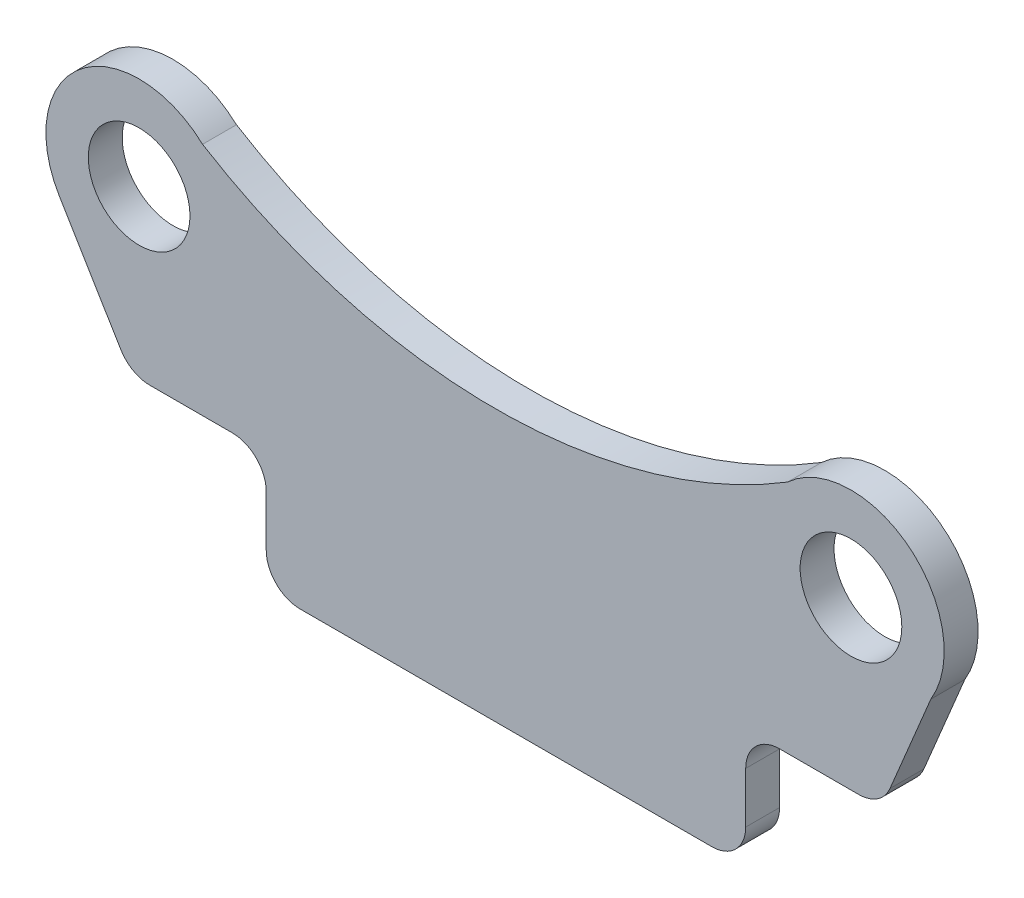
ISO-10303-21;
HEADER;
FILE_DESCRIPTION(('STEP AP214'),'2;1');
FILE_NAME('part.step','',(''),(''),'','','');
FILE_SCHEMA(('AUTOMOTIVE_DESIGN { 1 0 10303 214 1 1 1 1 }'));
ENDSEC;
DATA;
#1=APPLICATION_CONTEXT('core data for automotive mechanical design processes');
#2=APPLICATION_PROTOCOL_DEFINITION('international standard','automotive_design',2000,#1);
#3=PRODUCT_CONTEXT('',#1,'mechanical');
#4=PRODUCT('Part','Part','',(#3));
#5=PRODUCT_RELATED_PRODUCT_CATEGORY('part','',(#4));
#6=PRODUCT_DEFINITION_FORMATION('','',#4);
#7=PRODUCT_DEFINITION_CONTEXT('part definition',#1,'design');
#8=PRODUCT_DEFINITION('design','',#6,#7);
#9=PRODUCT_DEFINITION_SHAPE('','',#8);
#10=(LENGTH_UNIT() NAMED_UNIT(*) SI_UNIT(.MILLI.,.METRE.));
#11=(NAMED_UNIT(*) PLANE_ANGLE_UNIT() SI_UNIT($,.RADIAN.));
#12=(NAMED_UNIT(*) SI_UNIT($,.STERADIAN.) SOLID_ANGLE_UNIT());
#13=UNCERTAINTY_MEASURE_WITH_UNIT(LENGTH_MEASURE(1.E-05),#10,'distance_accuracy_value','');
#14=(GEOMETRIC_REPRESENTATION_CONTEXT(3) GLOBAL_UNCERTAINTY_ASSIGNED_CONTEXT((#13)) GLOBAL_UNIT_ASSIGNED_CONTEXT((#10,
#11,#12)) REPRESENTATION_CONTEXT('',''));
#15=CARTESIAN_POINT('',(0.,0.,0.));
#16=DIRECTION('',(0.,0.,1.));
#17=DIRECTION('',(1.,0.,0.));
#18=AXIS2_PLACEMENT_3D('',#15,#16,#17);
#19=CARTESIAN_POINT('',(0.,0.,20.));
#20=DIRECTION('',(0.,0.,1.));
#21=DIRECTION('',(1.,0.,0.));
#22=AXIS2_PLACEMENT_3D('',#19,#20,#21);
#23=PLANE('',#22);
#24=CARTESIAN_POINT('',(0.,0.,20.));
#25=DIRECTION('',(0.,0.,1.));
#26=DIRECTION('',(1.,0.,0.));
#27=AXIS2_PLACEMENT_3D('',#24,#25,#26);
#28=CIRCLE('',#27,30.);
#29=CARTESIAN_POINT('',(30.,0.,20.));
#30=VERTEX_POINT('',#29);
#31=EDGE_CURVE('E181',#30,#30,#28,.T.);
#32=ORIENTED_EDGE('',*,*,#31,.F.);
#33=EDGE_LOOP('',(#32));
#34=FACE_BOUND('',#33,.T.);
#35=CARTESIAN_POINT('',(0.,0.,20.));
#36=DIRECTION('',(0.,0.,1.));
#37=DIRECTION('',(1.,0.,0.));
#38=AXIS2_PLACEMENT_3D('',#35,#36,#37);
#39=CIRCLE('',#38,55.);
#40=CARTESIAN_POINT('',(37.4335843757219,40.29549305798,20.));
#41=VERTEX_POINT('',#40);
#42=CARTESIAN_POINT('',(-47.1249572840891,-28.359097322954,20.));
#43=VERTEX_POINT('',#42);
#44=EDGE_CURVE('E208',#41,#43,#39,.T.);
#45=ORIENTED_EDGE('',*,*,#44,.T.);
#46=DIRECTION('',(0.515619951326436,-0.856817405165257,0.));
#47=VECTOR('',#46,1.);
#48=CARTESIAN_POINT('',(-47.1249572840891,-28.359097322954,20.));
#49=LINE('',#48,#47);
#50=CARTESIAN_POINT('',(-10.8298539598969,-88.6714963494826,20.));
#51=VERTEX_POINT('',#50);
#52=EDGE_CURVE('E116',#43,#51,#49,.T.);
#53=ORIENTED_EDGE('',*,*,#52,.T.);
#54=CARTESIAN_POINT('',(6.30649414340832,-78.359097322954,20.));
#55=DIRECTION('',(0.,0.,1.));
#56=DIRECTION('',(1.,0.,0.));
#57=AXIS2_PLACEMENT_3D('',#54,#55,#56);
#58=CIRCLE('',#57,20.);
#59=CARTESIAN_POINT('',(6.30649414340841,-98.359097322954,20.));
#60=VERTEX_POINT('',#59);
#61=EDGE_CURVE('E247',#51,#60,#58,.T.);
#62=ORIENTED_EDGE('',*,*,#61,.T.);
#63=DIRECTION('',(1.,0.,0.));
#64=VECTOR('',#63,1.);
#65=CARTESIAN_POINT('',(6.30649414340841,-98.359097322954,20.));
#66=LINE('',#65,#64);
#67=CARTESIAN_POINT('',(54.9999999999999,-98.359097322954,20.));
#68=VERTEX_POINT('',#67);
#69=EDGE_CURVE('E266',#60,#68,#66,.T.);
#70=ORIENTED_EDGE('',*,*,#69,.T.);
#71=CARTESIAN_POINT('',(55.,-118.359097322954,20.));
#72=DIRECTION('',(0.,0.,-1.));
#73=DIRECTION('',(-1.,0.,0.));
#74=AXIS2_PLACEMENT_3D('',#71,#72,#73);
#75=CIRCLE('',#74,20.);
#76=CARTESIAN_POINT('',(75.,-118.359097322954,20.));
#77=VERTEX_POINT('',#76);
#78=EDGE_CURVE('E263',#68,#77,#75,.T.);
#79=ORIENTED_EDGE('',*,*,#78,.T.);
#80=DIRECTION('',(0.,-1.,0.));
#81=VECTOR('',#80,1.);
#82=CARTESIAN_POINT('',(75.,-118.359097322954,20.));
#83=LINE('',#82,#81);
#84=CARTESIAN_POINT('',(75.,-148.359097322954,20.));
#85=VERTEX_POINT('',#84);
#86=EDGE_CURVE('E265',#77,#85,#83,.T.);
#87=ORIENTED_EDGE('',*,*,#86,.T.);
#88=CARTESIAN_POINT('',(95.,-148.359097322954,20.));
#89=DIRECTION('',(0.,0.,1.));
#90=DIRECTION('',(1.,0.,0.));
#91=AXIS2_PLACEMENT_3D('',#88,#89,#90);
#92=CIRCLE('',#91,20.);
#93=CARTESIAN_POINT('',(95.0000000000002,-168.359097322954,20.));
#94=VERTEX_POINT('',#93);
#95=EDGE_CURVE('E268',#85,#94,#92,.T.);
#96=ORIENTED_EDGE('',*,*,#95,.T.);
#97=DIRECTION('',(1.,0.,0.));
#98=VECTOR('',#97,1.);
#99=CARTESIAN_POINT('',(95.0000000000002,-168.359097322954,20.));
#100=LINE('',#99,#98);
#101=CARTESIAN_POINT('',(337.882293863227,-168.359097322954,20.));
#102=VERTEX_POINT('',#101);
#103=EDGE_CURVE('E274',#94,#102,#100,.T.);
#104=ORIENTED_EDGE('',*,*,#103,.T.);
#105=CARTESIAN_POINT('',(337.882293863227,-148.359097322954,20.));
#106=DIRECTION('',(0.,0.,1.));
#107=DIRECTION('',(1.,0.,0.));
#108=AXIS2_PLACEMENT_3D('',#105,#106,#107);
#109=CIRCLE('',#108,20.);
#110=CARTESIAN_POINT('',(357.882293863227,-148.359097322954,20.));
#111=VERTEX_POINT('',#110);
#112=EDGE_CURVE('E276',#102,#111,#109,.T.);
#113=ORIENTED_EDGE('',*,*,#112,.T.);
#114=DIRECTION('',(0.,1.,0.));
#115=VECTOR('',#114,1.);
#116=CARTESIAN_POINT('',(357.882293863227,-148.359097322954,20.));
#117=LINE('',#116,#115);
#118=CARTESIAN_POINT('',(357.882293863227,-118.359097322954,20.));
#119=VERTEX_POINT('',#118);
#120=EDGE_CURVE('E278',#111,#119,#117,.T.);
#121=ORIENTED_EDGE('',*,*,#120,.T.);
#122=CARTESIAN_POINT('',(377.882293863227,-118.359097322954,20.));
#123=DIRECTION('',(0.,0.,-1.));
#124=DIRECTION('',(1.,0.,0.));
#125=AXIS2_PLACEMENT_3D('',#122,#123,#124);
#126=CIRCLE('',#125,20.);
#127=CARTESIAN_POINT('',(377.882293863227,-98.359097322954,20.));
#128=VERTEX_POINT('',#127);
#129=EDGE_CURVE('E280',#119,#128,#126,.T.);
#130=ORIENTED_EDGE('',*,*,#129,.T.);
#131=DIRECTION('',(1.,0.,0.));
#132=VECTOR('',#131,1.);
#133=CARTESIAN_POINT('',(424.562313329542,-98.359097322954,20.));
#134=LINE('',#133,#132);
#135=CARTESIAN_POINT('',(424.562313329542,-98.359097322954,20.));
#136=VERTEX_POINT('',#135);
#137=EDGE_CURVE('E282',#128,#136,#134,.T.);
#138=ORIENTED_EDGE('',*,*,#137,.T.);
#139=CARTESIAN_POINT('',(424.562313329542,-78.359097322954,20.));
#140=DIRECTION('',(0.,0.,1.));
#141=DIRECTION('',(-1.,0.,0.));
#142=AXIS2_PLACEMENT_3D('',#139,#140,#141);
#143=CIRCLE('',#142,20.);
#144=CARTESIAN_POINT('',(443.016730749236,-86.0684732834138,20.));
#145=VERTEX_POINT('',#144);
#146=EDGE_CURVE('E159',#136,#145,#143,.T.);
#147=ORIENTED_EDGE('',*,*,#146,.T.);
#148=DIRECTION('',(0.385468798022994,0.92272087098467,0.));
#149=VECTOR('',#148,1.);
#150=CARTESIAN_POINT('',(467.124957284089,-28.359097322954,20.));
#151=LINE('',#150,#149);
#152=CARTESIAN_POINT('',(467.124957284089,-28.359097322954,20.));
#153=VERTEX_POINT('',#152);
#154=EDGE_CURVE('E153',#145,#153,#151,.T.);
#155=ORIENTED_EDGE('',*,*,#154,.T.);
#156=CARTESIAN_POINT('',(420.,0.,20.));
#157=DIRECTION('',(0.,0.,1.));
#158=DIRECTION('',(1.,0.,0.));
#159=AXIS2_PLACEMENT_3D('',#156,#157,#158);
#160=CIRCLE('',#159,55.);
#161=CARTESIAN_POINT('',(382.566415624278,40.2954930579801,20.));
#162=VERTEX_POINT('',#161);
#163=EDGE_CURVE('E157',#153,#162,#160,.T.);
#164=ORIENTED_EDGE('',*,*,#163,.T.);
#165=CARTESIAN_POINT('',(210.,321.414913793637,20.));
#166=DIRECTION('',(0.,0.,-1.));
#167=DIRECTION('',(1.,0.,0.));
#168=AXIS2_PLACEMENT_3D('',#165,#166,#167);
#169=CIRCLE('',#168,329.859510270906);
#170=EDGE_CURVE('E49',#162,#41,#169,.T.);
#171=ORIENTED_EDGE('',*,*,#170,.T.);
#172=EDGE_LOOP('',(#45,#53,#62,#70,#79,#87,#96,#104,#113,#121,#130,#138,#147,#155,#164,#171));
#173=FACE_BOUND('',#172,.T.);
#174=CARTESIAN_POINT('',(420.,0.,20.));
#175=DIRECTION('',(0.,0.,1.));
#176=DIRECTION('',(1.,0.,0.));
#177=AXIS2_PLACEMENT_3D('',#174,#175,#176);
#178=CIRCLE('',#177,30.);
#179=CARTESIAN_POINT('',(450.,0.,20.));
#180=VERTEX_POINT('',#179);
#181=EDGE_CURVE('E324',#180,#180,#178,.T.);
#182=ORIENTED_EDGE('',*,*,#181,.F.);
#183=EDGE_LOOP('',(#182));
#184=FACE_BOUND('',#183,.T.);
#185=ADVANCED_FACE('F32',(#34,#173,#184),#23,.T.);
#186=CARTESIAN_POINT('',(0.,0.,0.));
#187=DIRECTION('',(0.,0.,1.));
#188=DIRECTION('',(1.,0.,0.));
#189=AXIS2_PLACEMENT_3D('',#186,#187,#188);
#190=PLANE('',#189);
#191=CARTESIAN_POINT('',(0.,0.,0.));
#192=DIRECTION('',(0.,0.,1.));
#193=DIRECTION('',(1.,0.,0.));
#194=AXIS2_PLACEMENT_3D('',#191,#192,#193);
#195=CIRCLE('',#194,55.);
#196=CARTESIAN_POINT('',(37.4335843757219,40.29549305798,0.));
#197=VERTEX_POINT('',#196);
#198=CARTESIAN_POINT('',(-47.1249572840891,-28.359097322954,0.));
#199=VERTEX_POINT('',#198);
#200=EDGE_CURVE('E177',#197,#199,#195,.T.);
#201=ORIENTED_EDGE('',*,*,#200,.F.);
#202=CARTESIAN_POINT('',(210.,321.414913793637,0.));
#203=DIRECTION('',(0.,0.,-1.));
#204=DIRECTION('',(1.,0.,0.));
#205=AXIS2_PLACEMENT_3D('',#202,#203,#204);
#206=CIRCLE('',#205,329.859510270906);
#207=CARTESIAN_POINT('',(382.566415624278,40.2954930579801,0.));
#208=VERTEX_POINT('',#207);
#209=EDGE_CURVE('E108',#208,#197,#206,.T.);
#210=ORIENTED_EDGE('',*,*,#209,.F.);
#211=CARTESIAN_POINT('',(420.,0.,0.));
#212=DIRECTION('',(0.,0.,1.));
#213=DIRECTION('',(1.,0.,0.));
#214=AXIS2_PLACEMENT_3D('',#211,#212,#213);
#215=CIRCLE('',#214,55.);
#216=CARTESIAN_POINT('',(467.124957284089,-28.359097322954,0.));
#217=VERTEX_POINT('',#216);
#218=EDGE_CURVE('E102',#217,#208,#215,.T.);
#219=ORIENTED_EDGE('',*,*,#218,.F.);
#220=DIRECTION('',(0.385468798022994,0.92272087098467,0.));
#221=VECTOR('',#220,1.);
#222=CARTESIAN_POINT('',(467.124957284089,-28.359097322954,0.));
#223=LINE('',#222,#221);
#224=CARTESIAN_POINT('',(443.016730749236,-86.0684732834138,0.));
#225=VERTEX_POINT('',#224);
#226=EDGE_CURVE('E167',#225,#217,#223,.T.);
#227=ORIENTED_EDGE('',*,*,#226,.F.);
#228=CARTESIAN_POINT('',(424.562313329542,-78.359097322954,0.));
#229=DIRECTION('',(0.,0.,1.));
#230=DIRECTION('',(-1.,0.,0.));
#231=AXIS2_PLACEMENT_3D('',#228,#229,#230);
#232=CIRCLE('',#231,20.);
#233=CARTESIAN_POINT('',(424.562313329542,-98.359097322954,0.));
#234=VERTEX_POINT('',#233);
#235=EDGE_CURVE('E203',#234,#225,#232,.T.);
#236=ORIENTED_EDGE('',*,*,#235,.F.);
#237=DIRECTION('',(1.,0.,0.));
#238=VECTOR('',#237,1.);
#239=CARTESIAN_POINT('',(424.562313329542,-98.359097322954,0.));
#240=LINE('',#239,#238);
#241=CARTESIAN_POINT('',(377.882293863227,-98.359097322954,0.));
#242=VERTEX_POINT('',#241);
#243=EDGE_CURVE('E201',#242,#234,#240,.T.);
#244=ORIENTED_EDGE('',*,*,#243,.F.);
#245=CARTESIAN_POINT('',(377.882293863227,-118.359097322954,0.));
#246=DIRECTION('',(0.,0.,-1.));
#247=DIRECTION('',(1.,0.,0.));
#248=AXIS2_PLACEMENT_3D('',#245,#246,#247);
#249=CIRCLE('',#248,20.);
#250=CARTESIAN_POINT('',(357.882293863227,-118.359097322954,0.));
#251=VERTEX_POINT('',#250);
#252=EDGE_CURVE('E199',#251,#242,#249,.T.);
#253=ORIENTED_EDGE('',*,*,#252,.F.);
#254=DIRECTION('',(0.,1.,0.));
#255=VECTOR('',#254,1.);
#256=CARTESIAN_POINT('',(357.882293863227,-148.359097322954,0.));
#257=LINE('',#256,#255);
#258=CARTESIAN_POINT('',(357.882293863227,-148.359097322954,0.));
#259=VERTEX_POINT('',#258);
#260=EDGE_CURVE('E197',#259,#251,#257,.T.);
#261=ORIENTED_EDGE('',*,*,#260,.F.);
#262=CARTESIAN_POINT('',(337.882293863227,-148.359097322954,0.));
#263=DIRECTION('',(0.,0.,1.));
#264=DIRECTION('',(1.,0.,0.));
#265=AXIS2_PLACEMENT_3D('',#262,#263,#264);
#266=CIRCLE('',#265,20.);
#267=CARTESIAN_POINT('',(337.882293863227,-168.359097322954,0.));
#268=VERTEX_POINT('',#267);
#269=EDGE_CURVE('E195',#268,#259,#266,.T.);
#270=ORIENTED_EDGE('',*,*,#269,.F.);
#271=DIRECTION('',(1.,0.,0.));
#272=VECTOR('',#271,1.);
#273=CARTESIAN_POINT('',(95.0000000000002,-168.359097322954,0.));
#274=LINE('',#273,#272);
#275=CARTESIAN_POINT('',(95.0000000000002,-168.359097322954,0.));
#276=VERTEX_POINT('',#275);
#277=EDGE_CURVE('E193',#276,#268,#274,.T.);
#278=ORIENTED_EDGE('',*,*,#277,.F.);
#279=CARTESIAN_POINT('',(95.,-148.359097322954,0.));
#280=DIRECTION('',(0.,0.,1.));
#281=DIRECTION('',(1.,0.,0.));
#282=AXIS2_PLACEMENT_3D('',#279,#280,#281);
#283=CIRCLE('',#282,20.);
#284=CARTESIAN_POINT('',(75.,-148.359097322954,0.));
#285=VERTEX_POINT('',#284);
#286=EDGE_CURVE('E191',#285,#276,#283,.T.);
#287=ORIENTED_EDGE('',*,*,#286,.F.);
#288=DIRECTION('',(0.,-1.,0.));
#289=VECTOR('',#288,1.);
#290=CARTESIAN_POINT('',(75.,-118.359097322954,0.));
#291=LINE('',#290,#289);
#292=CARTESIAN_POINT('',(75.,-118.359097322954,0.));
#293=VERTEX_POINT('',#292);
#294=EDGE_CURVE('E189',#293,#285,#291,.T.);
#295=ORIENTED_EDGE('',*,*,#294,.F.);
#296=CARTESIAN_POINT('',(55.,-118.359097322954,0.));
#297=DIRECTION('',(0.,0.,-1.));
#298=DIRECTION('',(-1.,0.,0.));
#299=AXIS2_PLACEMENT_3D('',#296,#297,#298);
#300=CIRCLE('',#299,20.);
#301=CARTESIAN_POINT('',(54.9999999999999,-98.359097322954,0.));
#302=VERTEX_POINT('',#301);
#303=EDGE_CURVE('E187',#302,#293,#300,.T.);
#304=ORIENTED_EDGE('',*,*,#303,.F.);
#305=DIRECTION('',(1.,0.,0.));
#306=VECTOR('',#305,1.);
#307=CARTESIAN_POINT('',(6.30649414340841,-98.359097322954,0.));
#308=LINE('',#307,#306);
#309=CARTESIAN_POINT('',(6.30649414340841,-98.359097322954,0.));
#310=VERTEX_POINT('',#309);
#311=EDGE_CURVE('E185',#310,#302,#308,.T.);
#312=ORIENTED_EDGE('',*,*,#311,.F.);
#313=CARTESIAN_POINT('',(6.30649414340832,-78.359097322954,0.));
#314=DIRECTION('',(0.,0.,1.));
#315=DIRECTION('',(1.,0.,0.));
#316=AXIS2_PLACEMENT_3D('',#313,#314,#315);
#317=CIRCLE('',#316,20.);
#318=CARTESIAN_POINT('',(-10.8298539598969,-88.6714963494826,0.));
#319=VERTEX_POINT('',#318);
#320=EDGE_CURVE('E183',#319,#310,#317,.T.);
#321=ORIENTED_EDGE('',*,*,#320,.F.);
#322=DIRECTION('',(0.515619951326436,-0.856817405165257,0.));
#323=VECTOR('',#322,1.);
#324=CARTESIAN_POINT('',(-47.1249572840891,-28.359097322954,0.));
#325=LINE('',#324,#323);
#326=EDGE_CURVE('E180',#199,#319,#325,.T.);
#327=ORIENTED_EDGE('',*,*,#326,.F.);
#328=EDGE_LOOP('',(#201,#210,#219,#227,#236,#244,#253,#261,#270,#278,#287,#295,#304,#312,#321,#327));
#329=FACE_BOUND('',#328,.T.);
#330=CARTESIAN_POINT('',(0.,0.,0.));
#331=DIRECTION('',(0.,0.,1.));
#332=DIRECTION('',(1.,0.,0.));
#333=AXIS2_PLACEMENT_3D('',#330,#331,#332);
#334=CIRCLE('',#333,30.);
#335=CARTESIAN_POINT('',(30.,0.,0.));
#336=VERTEX_POINT('',#335);
#337=EDGE_CURVE('E330',#336,#336,#334,.T.);
#338=ORIENTED_EDGE('',*,*,#337,.T.);
#339=EDGE_LOOP('',(#338));
#340=FACE_BOUND('',#339,.T.);
#341=CARTESIAN_POINT('',(420.,0.,0.));
#342=DIRECTION('',(0.,0.,1.));
#343=DIRECTION('',(1.,0.,0.));
#344=AXIS2_PLACEMENT_3D('',#341,#342,#343);
#345=CIRCLE('',#344,30.);
#346=CARTESIAN_POINT('',(450.,0.,0.));
#347=VERTEX_POINT('',#346);
#348=EDGE_CURVE('E327',#347,#347,#345,.T.);
#349=ORIENTED_EDGE('',*,*,#348,.T.);
#350=EDGE_LOOP('',(#349));
#351=FACE_BOUND('',#350,.T.);
#352=ADVANCED_FACE('F251',(#329,#340,#351),#190,.F.);
#353=CARTESIAN_POINT('',(0.,0.,20.));
#354=DIRECTION('',(0.,0.,-1.));
#355=DIRECTION('',(-1.,0.,0.));
#356=AXIS2_PLACEMENT_3D('',#353,#354,#355);
#357=CYLINDRICAL_SURFACE('',#356,55.);
#358=ORIENTED_EDGE('',*,*,#200,.T.);
#359=DIRECTION('',(0.,0.,-1.));
#360=VECTOR('',#359,1.);
#361=CARTESIAN_POINT('',(-47.1249572840891,-28.359097322954,20.));
#362=LINE('',#361,#360);
#363=EDGE_CURVE('E11',#43,#199,#362,.T.);
#364=ORIENTED_EDGE('',*,*,#363,.F.);
#365=ORIENTED_EDGE('',*,*,#44,.F.);
#366=DIRECTION('',(0.,0.,-1.));
#367=VECTOR('',#366,1.);
#368=CARTESIAN_POINT('',(37.4335843757219,40.29549305798,20.));
#369=LINE('',#368,#367);
#370=EDGE_CURVE('E173',#41,#197,#369,.T.);
#371=ORIENTED_EDGE('',*,*,#370,.T.);
#372=EDGE_LOOP('',(#358,#364,#365,#371));
#373=FACE_BOUND('',#372,.T.);
#374=ADVANCED_FACE('F34',(#373),#357,.T.);
#375=CARTESIAN_POINT('',(-47.1249572840891,-28.359097322954,20.));
#376=DIRECTION('',(0.856817405165257,0.515619951326436,0.));
#377=DIRECTION('',(-0.515619951326436,0.856817405165257,0.));
#378=AXIS2_PLACEMENT_3D('',#375,#376,#377);
#379=PLANE('',#378);
#380=ORIENTED_EDGE('',*,*,#326,.T.);
#381=DIRECTION('',(0.,0.,-1.));
#382=VECTOR('',#381,1.);
#383=CARTESIAN_POINT('',(-10.8298539598969,-88.6714963494826,20.));
#384=LINE('',#383,#382);
#385=EDGE_CURVE('E41',#51,#319,#384,.T.);
#386=ORIENTED_EDGE('',*,*,#385,.F.);
#387=ORIENTED_EDGE('',*,*,#52,.F.);
#388=ORIENTED_EDGE('',*,*,#363,.T.);
#389=EDGE_LOOP('',(#380,#386,#387,#388));
#390=FACE_BOUND('',#389,.T.);
#391=ADVANCED_FACE('F463',(#390),#379,.F.);
#392=CARTESIAN_POINT('',(6.30649414340832,-78.359097322954,20.));
#393=DIRECTION('',(0.,0.,-1.));
#394=DIRECTION('',(-1.,0.,0.));
#395=AXIS2_PLACEMENT_3D('',#392,#393,#394);
#396=CYLINDRICAL_SURFACE('',#395,20.);
#397=ORIENTED_EDGE('',*,*,#320,.T.);
#398=DIRECTION('',(0.,0.,-1.));
#399=VECTOR('',#398,1.);
#400=CARTESIAN_POINT('',(6.30649414340841,-98.359097322954,20.));
#401=LINE('',#400,#399);
#402=EDGE_CURVE('E239',#60,#310,#401,.T.);
#403=ORIENTED_EDGE('',*,*,#402,.F.);
#404=ORIENTED_EDGE('',*,*,#61,.F.);
#405=ORIENTED_EDGE('',*,*,#385,.T.);
#406=EDGE_LOOP('',(#397,#403,#404,#405));
#407=FACE_BOUND('',#406,.T.);
#408=ADVANCED_FACE('F245',(#407),#396,.T.);
#409=CARTESIAN_POINT('',(6.30649414340841,-98.359097322954,20.));
#410=DIRECTION('',(0.,1.,0.));
#411=DIRECTION('',(0.,0.,1.));
#412=AXIS2_PLACEMENT_3D('',#409,#410,#411);
#413=PLANE('',#412);
#414=ORIENTED_EDGE('',*,*,#311,.T.);
#415=DIRECTION('',(0.,0.,-1.));
#416=VECTOR('',#415,1.);
#417=CARTESIAN_POINT('',(54.9999999999999,-98.359097322954,20.));
#418=LINE('',#417,#416);
#419=EDGE_CURVE('E236',#68,#302,#418,.T.);
#420=ORIENTED_EDGE('',*,*,#419,.F.);
#421=ORIENTED_EDGE('',*,*,#69,.F.);
#422=ORIENTED_EDGE('',*,*,#402,.T.);
#423=EDGE_LOOP('',(#414,#420,#421,#422));
#424=FACE_BOUND('',#423,.T.);
#425=ADVANCED_FACE('F257',(#424),#413,.F.);
#426=CARTESIAN_POINT('',(55.,-118.359097322954,20.));
#427=DIRECTION('',(0.,0.,-1.));
#428=DIRECTION('',(-1.,0.,0.));
#429=AXIS2_PLACEMENT_3D('',#426,#427,#428);
#430=CYLINDRICAL_SURFACE('',#429,20.);
#431=ORIENTED_EDGE('',*,*,#303,.T.);
#432=DIRECTION('',(0.,0.,-1.));
#433=VECTOR('',#432,1.);
#434=CARTESIAN_POINT('',(75.,-118.359097322954,20.));
#435=LINE('',#434,#433);
#436=EDGE_CURVE('E233',#77,#293,#435,.T.);
#437=ORIENTED_EDGE('',*,*,#436,.F.);
#438=ORIENTED_EDGE('',*,*,#78,.F.);
#439=ORIENTED_EDGE('',*,*,#419,.T.);
#440=EDGE_LOOP('',(#431,#437,#438,#439));
#441=FACE_BOUND('',#440,.T.);
#442=ADVANCED_FACE('F261',(#441),#430,.F.);
#443=CARTESIAN_POINT('',(75.,-118.359097322954,20.));
#444=DIRECTION('',(1.,0.,0.));
#445=DIRECTION('',(0.,1.,0.));
#446=AXIS2_PLACEMENT_3D('',#443,#444,#445);
#447=PLANE('',#446);
#448=ORIENTED_EDGE('',*,*,#294,.T.);
#449=DIRECTION('',(0.,0.,-1.));
#450=VECTOR('',#449,1.);
#451=CARTESIAN_POINT('',(75.,-148.359097322954,20.));
#452=LINE('',#451,#450);
#453=EDGE_CURVE('E230',#85,#285,#452,.T.);
#454=ORIENTED_EDGE('',*,*,#453,.F.);
#455=ORIENTED_EDGE('',*,*,#86,.F.);
#456=ORIENTED_EDGE('',*,*,#436,.T.);
#457=EDGE_LOOP('',(#448,#454,#455,#456));
#458=FACE_BOUND('',#457,.T.);
#459=ADVANCED_FACE('F428',(#458),#447,.F.);
#460=CARTESIAN_POINT('',(95.,-148.359097322954,20.));
#461=DIRECTION('',(0.,0.,-1.));
#462=DIRECTION('',(-1.,0.,0.));
#463=AXIS2_PLACEMENT_3D('',#460,#461,#462);
#464=CYLINDRICAL_SURFACE('',#463,20.);
#465=ORIENTED_EDGE('',*,*,#286,.T.);
#466=DIRECTION('',(0.,0.,-1.));
#467=VECTOR('',#466,1.);
#468=CARTESIAN_POINT('',(95.0000000000002,-168.359097322954,20.));
#469=LINE('',#468,#467);
#470=EDGE_CURVE('E227',#94,#276,#469,.T.);
#471=ORIENTED_EDGE('',*,*,#470,.F.);
#472=ORIENTED_EDGE('',*,*,#95,.F.);
#473=ORIENTED_EDGE('',*,*,#453,.T.);
#474=EDGE_LOOP('',(#465,#471,#472,#473));
#475=FACE_BOUND('',#474,.T.);
#476=ADVANCED_FACE('F418',(#475),#464,.T.);
#477=CARTESIAN_POINT('',(95.0000000000002,-168.359097322954,20.));
#478=DIRECTION('',(0.,1.,0.));
#479=DIRECTION('',(0.,0.,1.));
#480=AXIS2_PLACEMENT_3D('',#477,#478,#479);
#481=PLANE('',#480);
#482=ORIENTED_EDGE('',*,*,#277,.T.);
#483=DIRECTION('',(0.,0.,-1.));
#484=VECTOR('',#483,1.);
#485=CARTESIAN_POINT('',(337.882293863227,-168.359097322954,20.));
#486=LINE('',#485,#484);
#487=EDGE_CURVE('E224',#102,#268,#486,.T.);
#488=ORIENTED_EDGE('',*,*,#487,.F.);
#489=ORIENTED_EDGE('',*,*,#103,.F.);
#490=ORIENTED_EDGE('',*,*,#470,.T.);
#491=EDGE_LOOP('',(#482,#488,#489,#490));
#492=FACE_BOUND('',#491,.T.);
#493=ADVANCED_FACE('F408',(#492),#481,.F.);
#494=CARTESIAN_POINT('',(337.882293863227,-148.359097322954,20.));
#495=DIRECTION('',(0.,0.,-1.));
#496=DIRECTION('',(-1.,0.,0.));
#497=AXIS2_PLACEMENT_3D('',#494,#495,#496);
#498=CYLINDRICAL_SURFACE('',#497,20.);
#499=ORIENTED_EDGE('',*,*,#269,.T.);
#500=DIRECTION('',(0.,0.,-1.));
#501=VECTOR('',#500,1.);
#502=CARTESIAN_POINT('',(357.882293863227,-148.359097322954,20.));
#503=LINE('',#502,#501);
#504=EDGE_CURVE('E221',#111,#259,#503,.T.);
#505=ORIENTED_EDGE('',*,*,#504,.F.);
#506=ORIENTED_EDGE('',*,*,#112,.F.);
#507=ORIENTED_EDGE('',*,*,#487,.T.);
#508=EDGE_LOOP('',(#499,#505,#506,#507));
#509=FACE_BOUND('',#508,.T.);
#510=ADVANCED_FACE('F398',(#509),#498,.T.);
#511=CARTESIAN_POINT('',(357.882293863227,-148.359097322954,20.));
#512=DIRECTION('',(-1.,0.,0.));
#513=DIRECTION('',(0.,0.,1.));
#514=AXIS2_PLACEMENT_3D('',#511,#512,#513);
#515=PLANE('',#514);
#516=ORIENTED_EDGE('',*,*,#260,.T.);
#517=DIRECTION('',(0.,0.,-1.));
#518=VECTOR('',#517,1.);
#519=CARTESIAN_POINT('',(357.882293863227,-118.359097322954,20.));
#520=LINE('',#519,#518);
#521=EDGE_CURVE('E218',#119,#251,#520,.T.);
#522=ORIENTED_EDGE('',*,*,#521,.F.);
#523=ORIENTED_EDGE('',*,*,#120,.F.);
#524=ORIENTED_EDGE('',*,*,#504,.T.);
#525=EDGE_LOOP('',(#516,#522,#523,#524));
#526=FACE_BOUND('',#525,.T.);
#527=ADVANCED_FACE('F388',(#526),#515,.F.);
#528=CARTESIAN_POINT('',(377.882293863227,-118.359097322954,20.));
#529=DIRECTION('',(0.,0.,-1.));
#530=DIRECTION('',(-1.,0.,0.));
#531=AXIS2_PLACEMENT_3D('',#528,#529,#530);
#532=CYLINDRICAL_SURFACE('',#531,20.);
#533=ORIENTED_EDGE('',*,*,#252,.T.);
#534=DIRECTION('',(0.,0.,-1.));
#535=VECTOR('',#534,1.);
#536=CARTESIAN_POINT('',(377.882293863227,-98.359097322954,20.));
#537=LINE('',#536,#535);
#538=EDGE_CURVE('E215',#128,#242,#537,.T.);
#539=ORIENTED_EDGE('',*,*,#538,.F.);
#540=ORIENTED_EDGE('',*,*,#129,.F.);
#541=ORIENTED_EDGE('',*,*,#521,.T.);
#542=EDGE_LOOP('',(#533,#539,#540,#541));
#543=FACE_BOUND('',#542,.T.);
#544=ADVANCED_FACE('F379',(#543),#532,.F.);
#545=CARTESIAN_POINT('',(424.562313329542,-98.359097322954,20.));
#546=DIRECTION('',(0.,1.,0.));
#547=DIRECTION('',(-1.,0.,0.));
#548=AXIS2_PLACEMENT_3D('',#545,#546,#547);
#549=PLANE('',#548);
#550=ORIENTED_EDGE('',*,*,#243,.T.);
#551=DIRECTION('',(0.,0.,-1.));
#552=VECTOR('',#551,1.);
#553=CARTESIAN_POINT('',(424.562313329542,-98.359097322954,20.));
#554=LINE('',#553,#552);
#555=EDGE_CURVE('E212',#136,#234,#554,.T.);
#556=ORIENTED_EDGE('',*,*,#555,.F.);
#557=ORIENTED_EDGE('',*,*,#137,.F.);
#558=ORIENTED_EDGE('',*,*,#538,.T.);
#559=EDGE_LOOP('',(#550,#556,#557,#558));
#560=FACE_BOUND('',#559,.T.);
#561=ADVANCED_FACE('F288',(#560),#549,.F.);
#562=CARTESIAN_POINT('',(424.562313329542,-78.359097322954,20.));
#563=DIRECTION('',(0.,0.,-1.));
#564=DIRECTION('',(-1.,0.,0.));
#565=AXIS2_PLACEMENT_3D('',#562,#563,#564);
#566=CYLINDRICAL_SURFACE('',#565,20.);
#567=ORIENTED_EDGE('',*,*,#235,.T.);
#568=DIRECTION('',(0.,0.,-1.));
#569=VECTOR('',#568,1.);
#570=CARTESIAN_POINT('',(443.016730749236,-86.0684732834138,20.));
#571=LINE('',#570,#569);
#572=EDGE_CURVE('E168',#145,#225,#571,.T.);
#573=ORIENTED_EDGE('',*,*,#572,.F.);
#574=ORIENTED_EDGE('',*,*,#146,.F.);
#575=ORIENTED_EDGE('',*,*,#555,.T.);
#576=EDGE_LOOP('',(#567,#573,#574,#575));
#577=FACE_BOUND('',#576,.T.);
#578=ADVANCED_FACE('F292',(#577),#566,.T.);
#579=CARTESIAN_POINT('',(467.124957284089,-28.359097322954,20.));
#580=DIRECTION('',(-0.92272087098467,0.385468798022994,0.));
#581=DIRECTION('',(-0.385468798022994,-0.92272087098467,0.));
#582=AXIS2_PLACEMENT_3D('',#579,#580,#581);
#583=PLANE('',#582);
#584=ORIENTED_EDGE('',*,*,#226,.T.);
#585=DIRECTION('',(0.,0.,-1.));
#586=VECTOR('',#585,1.);
#587=CARTESIAN_POINT('',(467.124957284089,-28.359097322954,20.));
#588=LINE('',#587,#586);
#589=EDGE_CURVE('E164',#153,#217,#588,.T.);
#590=ORIENTED_EDGE('',*,*,#589,.F.);
#591=ORIENTED_EDGE('',*,*,#154,.F.);
#592=ORIENTED_EDGE('',*,*,#572,.T.);
#593=EDGE_LOOP('',(#584,#590,#591,#592));
#594=FACE_BOUND('',#593,.T.);
#595=ADVANCED_FACE('F165',(#594),#583,.F.);
#596=CARTESIAN_POINT('',(420.,0.,20.));
#597=DIRECTION('',(0.,0.,-1.));
#598=DIRECTION('',(-1.,0.,0.));
#599=AXIS2_PLACEMENT_3D('',#596,#597,#598);
#600=CYLINDRICAL_SURFACE('',#599,55.);
#601=ORIENTED_EDGE('',*,*,#218,.T.);
#602=DIRECTION('',(0.,0.,-1.));
#603=VECTOR('',#602,1.);
#604=CARTESIAN_POINT('',(382.566415624278,40.2954930579801,20.));
#605=LINE('',#604,#603);
#606=EDGE_CURVE('E169',#162,#208,#605,.T.);
#607=ORIENTED_EDGE('',*,*,#606,.F.);
#608=ORIENTED_EDGE('',*,*,#163,.F.);
#609=ORIENTED_EDGE('',*,*,#589,.T.);
#610=EDGE_LOOP('',(#601,#607,#608,#609));
#611=FACE_BOUND('',#610,.T.);
#612=ADVANCED_FACE('F171',(#611),#600,.T.);
#613=CARTESIAN_POINT('',(210.,321.414913793637,20.));
#614=DIRECTION('',(0.,0.,-1.));
#615=DIRECTION('',(-1.,0.,0.));
#616=AXIS2_PLACEMENT_3D('',#613,#614,#615);
#617=CYLINDRICAL_SURFACE('',#616,329.859510270906);
#618=ORIENTED_EDGE('',*,*,#209,.T.);
#619=ORIENTED_EDGE('',*,*,#370,.F.);
#620=ORIENTED_EDGE('',*,*,#170,.F.);
#621=ORIENTED_EDGE('',*,*,#606,.T.);
#622=EDGE_LOOP('',(#618,#619,#620,#621));
#623=FACE_BOUND('',#622,.T.);
#624=ADVANCED_FACE('F296',(#623),#617,.F.);
#625=CARTESIAN_POINT('',(0.,0.,20.));
#626=DIRECTION('',(0.,0.,-1.));
#627=DIRECTION('',(-1.,0.,0.));
#628=AXIS2_PLACEMENT_3D('',#625,#626,#627);
#629=CYLINDRICAL_SURFACE('',#628,30.);
#630=ORIENTED_EDGE('',*,*,#31,.T.);
#631=EDGE_LOOP('',(#630));
#632=FACE_BOUND('',#631,.T.);
#633=ORIENTED_EDGE('',*,*,#337,.F.);
#634=EDGE_LOOP('',(#633));
#635=FACE_BOUND('',#634,.T.);
#636=ADVANCED_FACE('F298',(#632,#635),#629,.F.);
#637=CARTESIAN_POINT('',(420.,0.,20.));
#638=DIRECTION('',(0.,0.,-1.));
#639=DIRECTION('',(-1.,0.,0.));
#640=AXIS2_PLACEMENT_3D('',#637,#638,#639);
#641=CYLINDRICAL_SURFACE('',#640,30.);
#642=ORIENTED_EDGE('',*,*,#181,.T.);
#643=EDGE_LOOP('',(#642));
#644=FACE_BOUND('',#643,.T.);
#645=ORIENTED_EDGE('',*,*,#348,.F.);
#646=EDGE_LOOP('',(#645));
#647=FACE_BOUND('',#646,.T.);
#648=ADVANCED_FACE('F304',(#644,#647),#641,.F.);
#649=CLOSED_SHELL('',(#185,#352,#374,#391,#408,#425,#442,#459,#476,#493,#510,#527,#544,#561,
#578,#595,#612,#624,#636,#648));
#650=MANIFOLD_SOLID_BREP('B2',#649);
#651=ADVANCED_BREP_SHAPE_REPRESENTATION('',(#18,#650),#14);
#652=SHAPE_DEFINITION_REPRESENTATION(#9,#651);
ENDSEC;
END-ISO-10303-21;
